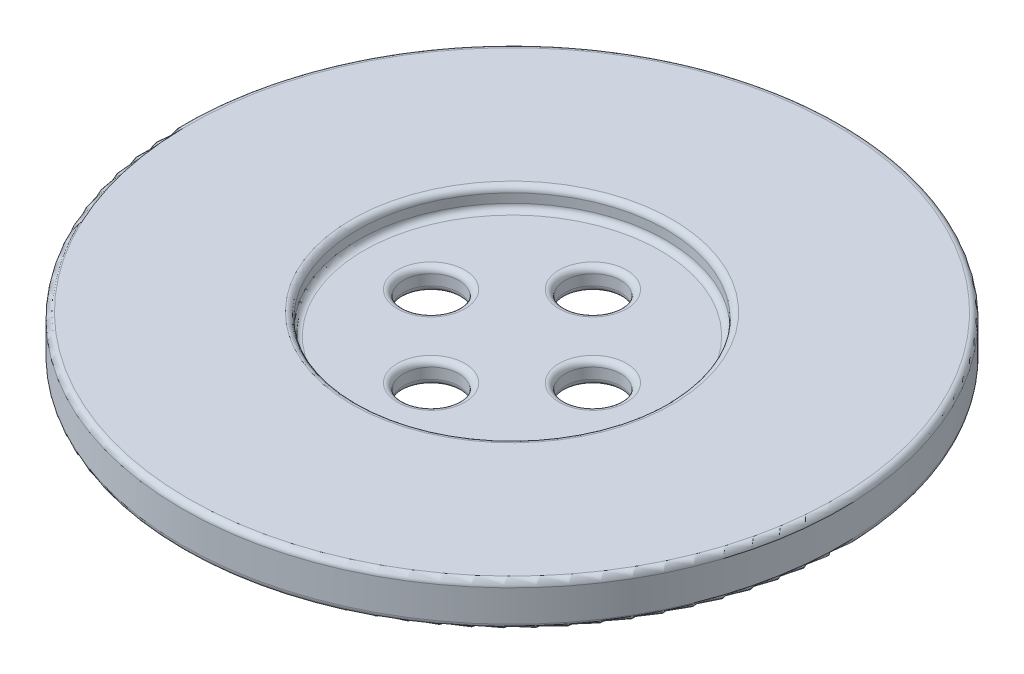
ISO-10303-21;
HEADER;
FILE_DESCRIPTION(('STEP AP214'),'2;1');
FILE_NAME('part.step','',(''),(''),'','','');
FILE_SCHEMA(('AUTOMOTIVE_DESIGN { 1 0 10303 214 1 1 1 1 }'));
ENDSEC;
DATA;
#1=APPLICATION_CONTEXT('core data for automotive mechanical design processes');
#2=APPLICATION_PROTOCOL_DEFINITION('international standard','automotive_design',2000,#1);
#3=PRODUCT_CONTEXT('',#1,'mechanical');
#4=PRODUCT('Part','Part','',(#3));
#5=PRODUCT_RELATED_PRODUCT_CATEGORY('part','',(#4));
#6=PRODUCT_DEFINITION_FORMATION('','',#4);
#7=PRODUCT_DEFINITION_CONTEXT('part definition',#1,'design');
#8=PRODUCT_DEFINITION('design','',#6,#7);
#9=PRODUCT_DEFINITION_SHAPE('','',#8);
#10=(LENGTH_UNIT() NAMED_UNIT(*) SI_UNIT(.MILLI.,.METRE.));
#11=(NAMED_UNIT(*) PLANE_ANGLE_UNIT() SI_UNIT($,.RADIAN.));
#12=(NAMED_UNIT(*) SI_UNIT($,.STERADIAN.) SOLID_ANGLE_UNIT());
#13=UNCERTAINTY_MEASURE_WITH_UNIT(LENGTH_MEASURE(1.E-05),#10,'distance_accuracy_value','');
#14=(GEOMETRIC_REPRESENTATION_CONTEXT(3) GLOBAL_UNCERTAINTY_ASSIGNED_CONTEXT((#13)) GLOBAL_UNIT_ASSIGNED_CONTEXT((#10,
#11,#12)) REPRESENTATION_CONTEXT('',''));
#15=CARTESIAN_POINT('',(0.,0.,0.));
#16=DIRECTION('',(0.,0.,1.));
#17=DIRECTION('',(1.,0.,0.));
#18=AXIS2_PLACEMENT_3D('',#15,#16,#17);
#19=CARTESIAN_POINT('',(0.,2.9,-5.4));
#20=DIRECTION('',(0.,-1.,0.));
#21=DIRECTION('',(0.,0.,-1.));
#22=AXIS2_PLACEMENT_3D('',#19,#20,#21);
#23=CYLINDRICAL_SURFACE('',#22,1.85);
#24=CARTESIAN_POINT('',(0.,1.1,-5.4));
#25=DIRECTION('',(0.,1.,0.));
#26=DIRECTION('',(0.,0.,1.));
#27=AXIS2_PLACEMENT_3D('',#24,#25,#26);
#28=CIRCLE('',#27,1.85);
#29=CARTESIAN_POINT('',(0.,1.1,-3.55));
#30=VERTEX_POINT('',#29);
#31=EDGE_CURVE('E46',#30,#30,#28,.T.);
#32=ORIENTED_EDGE('',*,*,#31,.T.);
#33=EDGE_LOOP('',(#32));
#34=FACE_BOUND('',#33,.T.);
#35=CARTESIAN_POINT('',(0.,0.4,-5.4));
#36=DIRECTION('',(0.,1.,0.));
#37=DIRECTION('',(0.,0.,1.));
#38=AXIS2_PLACEMENT_3D('',#35,#36,#37);
#39=CIRCLE('',#38,1.85);
#40=CARTESIAN_POINT('',(0.,0.4,-3.55));
#41=VERTEX_POINT('',#40);
#42=EDGE_CURVE('E50',#41,#41,#39,.F.);
#43=ORIENTED_EDGE('',*,*,#42,.T.);
#44=EDGE_LOOP('',(#43));
#45=FACE_BOUND('',#44,.T.);
#46=ADVANCED_FACE('F35',(#34,#45),#23,.F.);
#47=CARTESIAN_POINT('',(5.4,2.9,0.));
#48=DIRECTION('',(0.,-1.,0.));
#49=DIRECTION('',(0.,0.,-1.));
#50=AXIS2_PLACEMENT_3D('',#47,#48,#49);
#51=CYLINDRICAL_SURFACE('',#50,1.85);
#52=CARTESIAN_POINT('',(5.4,1.1,0.));
#53=DIRECTION('',(0.,1.,0.));
#54=DIRECTION('',(0.,0.,1.));
#55=AXIS2_PLACEMENT_3D('',#52,#53,#54);
#56=CIRCLE('',#55,1.85);
#57=CARTESIAN_POINT('',(5.4,1.1,1.85));
#58=VERTEX_POINT('',#57);
#59=EDGE_CURVE('E55',#58,#58,#56,.T.);
#60=ORIENTED_EDGE('',*,*,#59,.T.);
#61=EDGE_LOOP('',(#60));
#62=FACE_BOUND('',#61,.T.);
#63=CARTESIAN_POINT('',(5.4,0.4,0.));
#64=DIRECTION('',(0.,1.,0.));
#65=DIRECTION('',(0.,0.,1.));
#66=AXIS2_PLACEMENT_3D('',#63,#64,#65);
#67=CIRCLE('',#66,1.85);
#68=CARTESIAN_POINT('',(5.4,0.4,1.85));
#69=VERTEX_POINT('',#68);
#70=EDGE_CURVE('E58',#69,#69,#67,.F.);
#71=ORIENTED_EDGE('',*,*,#70,.T.);
#72=EDGE_LOOP('',(#71));
#73=FACE_BOUND('',#72,.T.);
#74=ADVANCED_FACE('F177',(#62,#73),#51,.F.);
#75=CARTESIAN_POINT('',(0.,2.9,5.4));
#76=DIRECTION('',(0.,-1.,0.));
#77=DIRECTION('',(0.,0.,-1.));
#78=AXIS2_PLACEMENT_3D('',#75,#76,#77);
#79=CYLINDRICAL_SURFACE('',#78,1.85);
#80=CARTESIAN_POINT('',(0.,1.1,5.4));
#81=DIRECTION('',(0.,1.,0.));
#82=DIRECTION('',(0.,0.,1.));
#83=AXIS2_PLACEMENT_3D('',#80,#81,#82);
#84=CIRCLE('',#83,1.85);
#85=CARTESIAN_POINT('',(0.,1.1,7.25));
#86=VERTEX_POINT('',#85);
#87=EDGE_CURVE('E61',#86,#86,#84,.T.);
#88=ORIENTED_EDGE('',*,*,#87,.T.);
#89=EDGE_LOOP('',(#88));
#90=FACE_BOUND('',#89,.T.);
#91=CARTESIAN_POINT('',(0.,0.4,5.4));
#92=DIRECTION('',(0.,1.,0.));
#93=DIRECTION('',(0.,0.,1.));
#94=AXIS2_PLACEMENT_3D('',#91,#92,#93);
#95=CIRCLE('',#94,1.85);
#96=CARTESIAN_POINT('',(0.,0.4,7.25));
#97=VERTEX_POINT('',#96);
#98=EDGE_CURVE('E64',#97,#97,#95,.F.);
#99=ORIENTED_EDGE('',*,*,#98,.T.);
#100=EDGE_LOOP('',(#99));
#101=FACE_BOUND('',#100,.T.);
#102=ADVANCED_FACE('F183',(#90,#101),#79,.F.);
#103=CARTESIAN_POINT('',(-5.4,2.9,0.));
#104=DIRECTION('',(0.,-1.,0.));
#105=DIRECTION('',(0.,0.,-1.));
#106=AXIS2_PLACEMENT_3D('',#103,#104,#105);
#107=CYLINDRICAL_SURFACE('',#106,1.85);
#108=CARTESIAN_POINT('',(-5.4,1.1,0.));
#109=DIRECTION('',(0.,1.,0.));
#110=DIRECTION('',(0.,0.,1.));
#111=AXIS2_PLACEMENT_3D('',#108,#109,#110);
#112=CIRCLE('',#111,1.85);
#113=CARTESIAN_POINT('',(-5.4,1.1,1.85));
#114=VERTEX_POINT('',#113);
#115=EDGE_CURVE('E10',#114,#114,#112,.T.);
#116=ORIENTED_EDGE('',*,*,#115,.T.);
#117=EDGE_LOOP('',(#116));
#118=FACE_BOUND('',#117,.T.);
#119=CARTESIAN_POINT('',(-5.4,0.4,0.));
#120=DIRECTION('',(0.,1.,0.));
#121=DIRECTION('',(0.,0.,1.));
#122=AXIS2_PLACEMENT_3D('',#119,#120,#121);
#123=CIRCLE('',#122,1.85);
#124=CARTESIAN_POINT('',(-5.4,0.4,1.85));
#125=VERTEX_POINT('',#124);
#126=EDGE_CURVE('E42',#125,#125,#123,.F.);
#127=ORIENTED_EDGE('',*,*,#126,.T.);
#128=EDGE_LOOP('',(#127));
#129=FACE_BOUND('',#128,.T.);
#130=ADVANCED_FACE('F130',(#118,#129),#107,.F.);
#131=CARTESIAN_POINT('',(0.,2.9,0.));
#132=DIRECTION('',(0.,1.,0.));
#133=DIRECTION('',(0.,0.,1.));
#134=AXIS2_PLACEMENT_3D('',#131,#132,#133);
#135=PLANE('',#134);
#136=CARTESIAN_POINT('',(0.,2.9,0.));
#137=DIRECTION('',(0.,1.,0.));
#138=DIRECTION('',(0.,0.,1.));
#139=AXIS2_PLACEMENT_3D('',#136,#137,#138);
#140=CIRCLE('',#139,21.6);
#141=CARTESIAN_POINT('',(0.,2.9,21.6));
#142=VERTEX_POINT('',#141);
#143=EDGE_CURVE('E88',#142,#142,#140,.T.);
#144=ORIENTED_EDGE('',*,*,#143,.T.);
#145=EDGE_LOOP('',(#144));
#146=FACE_BOUND('',#145,.T.);
#147=CARTESIAN_POINT('',(0.,2.9,0.));
#148=DIRECTION('',(0.,1.,0.));
#149=DIRECTION('',(0.,0.,1.));
#150=AXIS2_PLACEMENT_3D('',#147,#148,#149);
#151=CIRCLE('',#150,10.7);
#152=CARTESIAN_POINT('',(0.,2.9,10.7));
#153=VERTEX_POINT('',#152);
#154=EDGE_CURVE('E91',#153,#153,#151,.F.);
#155=ORIENTED_EDGE('',*,*,#154,.T.);
#156=EDGE_LOOP('',(#155));
#157=FACE_BOUND('',#156,.T.);
#158=ADVANCED_FACE('F126',(#146,#157),#135,.T.);
#159=CARTESIAN_POINT('',(0.,0.,0.));
#160=DIRECTION('',(0.,1.,0.));
#161=DIRECTION('',(0.,0.,1.));
#162=AXIS2_PLACEMENT_3D('',#159,#160,#161);
#163=PLANE('',#162);
#164=CARTESIAN_POINT('',(0.,0.,0.));
#165=DIRECTION('',(0.,1.,0.));
#166=DIRECTION('',(0.,0.,1.));
#167=AXIS2_PLACEMENT_3D('',#164,#165,#166);
#168=CIRCLE('',#167,21.6);
#169=CARTESIAN_POINT('',(0.,0.,21.6));
#170=VERTEX_POINT('',#169);
#171=EDGE_CURVE('E94',#170,#170,#168,.F.);
#172=ORIENTED_EDGE('',*,*,#171,.T.);
#173=EDGE_LOOP('',(#172));
#174=FACE_BOUND('',#173,.T.);
#175=CARTESIAN_POINT('',(0.,0.,5.4));
#176=DIRECTION('',(0.,1.,0.));
#177=DIRECTION('',(0.,0.,1.));
#178=AXIS2_PLACEMENT_3D('',#175,#176,#177);
#179=CIRCLE('',#178,2.25);
#180=CARTESIAN_POINT('',(0.,0.,7.65));
#181=VERTEX_POINT('',#180);
#182=EDGE_CURVE('E97',#181,#181,#179,.T.);
#183=ORIENTED_EDGE('',*,*,#182,.T.);
#184=EDGE_LOOP('',(#183));
#185=FACE_BOUND('',#184,.T.);
#186=CARTESIAN_POINT('',(5.4,0.,0.));
#187=DIRECTION('',(0.,1.,0.));
#188=DIRECTION('',(0.,0.,1.));
#189=AXIS2_PLACEMENT_3D('',#186,#187,#188);
#190=CIRCLE('',#189,2.25);
#191=CARTESIAN_POINT('',(5.4,0.,2.25));
#192=VERTEX_POINT('',#191);
#193=EDGE_CURVE('E100',#192,#192,#190,.T.);
#194=ORIENTED_EDGE('',*,*,#193,.T.);
#195=EDGE_LOOP('',(#194));
#196=FACE_BOUND('',#195,.T.);
#197=CARTESIAN_POINT('',(0.,0.,-5.4));
#198=DIRECTION('',(0.,1.,0.));
#199=DIRECTION('',(0.,0.,1.));
#200=AXIS2_PLACEMENT_3D('',#197,#198,#199);
#201=CIRCLE('',#200,2.25);
#202=CARTESIAN_POINT('',(0.,0.,-3.15));
#203=VERTEX_POINT('',#202);
#204=EDGE_CURVE('E103',#203,#203,#201,.T.);
#205=ORIENTED_EDGE('',*,*,#204,.T.);
#206=EDGE_LOOP('',(#205));
#207=FACE_BOUND('',#206,.T.);
#208=CARTESIAN_POINT('',(-5.4,0.,0.));
#209=DIRECTION('',(0.,1.,0.));
#210=DIRECTION('',(0.,0.,1.));
#211=AXIS2_PLACEMENT_3D('',#208,#209,#210);
#212=CIRCLE('',#211,2.25);
#213=CARTESIAN_POINT('',(-5.4,0.,2.25));
#214=VERTEX_POINT('',#213);
#215=EDGE_CURVE('E106',#214,#214,#212,.T.);
#216=ORIENTED_EDGE('',*,*,#215,.T.);
#217=EDGE_LOOP('',(#216));
#218=FACE_BOUND('',#217,.T.);
#219=ADVANCED_FACE('F129',(#174,#185,#196,#207,#218),#163,.F.);
#220=CARTESIAN_POINT('',(0.,2.9,0.));
#221=DIRECTION('',(0.,-1.,0.));
#222=DIRECTION('',(0.,0.,-1.));
#223=AXIS2_PLACEMENT_3D('',#220,#221,#222);
#224=CYLINDRICAL_SURFACE('',#223,22.);
#225=CARTESIAN_POINT('',(0.,0.4,0.));
#226=DIRECTION('',(0.,1.,0.));
#227=DIRECTION('',(0.,0.,1.));
#228=AXIS2_PLACEMENT_3D('',#225,#226,#227);
#229=CIRCLE('',#228,22.);
#230=CARTESIAN_POINT('',(0.,0.4,22.));
#231=VERTEX_POINT('',#230);
#232=EDGE_CURVE('E109',#231,#231,#229,.T.);
#233=ORIENTED_EDGE('',*,*,#232,.T.);
#234=EDGE_LOOP('',(#233));
#235=FACE_BOUND('',#234,.T.);
#236=CARTESIAN_POINT('',(0.,2.5,0.));
#237=DIRECTION('',(0.,1.,0.));
#238=DIRECTION('',(0.,0.,1.));
#239=AXIS2_PLACEMENT_3D('',#236,#237,#238);
#240=CIRCLE('',#239,22.);
#241=CARTESIAN_POINT('',(0.,2.5,22.));
#242=VERTEX_POINT('',#241);
#243=EDGE_CURVE('E112',#242,#242,#240,.F.);
#244=ORIENTED_EDGE('',*,*,#243,.T.);
#245=EDGE_LOOP('',(#244));
#246=FACE_BOUND('',#245,.T.);
#247=ADVANCED_FACE('F116',(#235,#246),#224,.T.);
#248=CARTESIAN_POINT('',(0.,1.5,0.));
#249=DIRECTION('',(0.,1.,0.));
#250=DIRECTION('',(0.,0.,1.));
#251=AXIS2_PLACEMENT_3D('',#248,#249,#250);
#252=CYLINDRICAL_SURFACE('',#251,10.3);
#253=CARTESIAN_POINT('',(0.,2.5,0.));
#254=DIRECTION('',(0.,1.,0.));
#255=DIRECTION('',(0.,0.,1.));
#256=AXIS2_PLACEMENT_3D('',#253,#254,#255);
#257=CIRCLE('',#256,10.3);
#258=CARTESIAN_POINT('',(0.,2.5,10.3));
#259=VERTEX_POINT('',#258);
#260=EDGE_CURVE('E82',#259,#259,#257,.T.);
#261=ORIENTED_EDGE('',*,*,#260,.T.);
#262=EDGE_LOOP('',(#261));
#263=FACE_BOUND('',#262,.T.);
#264=CARTESIAN_POINT('',(0.,1.9,0.));
#265=DIRECTION('',(0.,1.,0.));
#266=DIRECTION('',(0.,0.,1.));
#267=AXIS2_PLACEMENT_3D('',#264,#265,#266);
#268=CIRCLE('',#267,10.3);
#269=CARTESIAN_POINT('',(0.,1.9,10.3));
#270=VERTEX_POINT('',#269);
#271=EDGE_CURVE('E85',#270,#270,#268,.F.);
#272=ORIENTED_EDGE('',*,*,#271,.T.);
#273=EDGE_LOOP('',(#272));
#274=FACE_BOUND('',#273,.T.);
#275=ADVANCED_FACE('F140',(#263,#274),#252,.F.);
#276=CARTESIAN_POINT('',(0.,1.5,0.));
#277=DIRECTION('',(0.,1.,0.));
#278=DIRECTION('',(0.,0.,1.));
#279=AXIS2_PLACEMENT_3D('',#276,#277,#278);
#280=PLANE('',#279);
#281=CARTESIAN_POINT('',(0.,1.5,0.));
#282=DIRECTION('',(0.,1.,0.));
#283=DIRECTION('',(0.,0.,1.));
#284=AXIS2_PLACEMENT_3D('',#281,#282,#283);
#285=CIRCLE('',#284,9.9);
#286=CARTESIAN_POINT('',(0.,1.5,9.9));
#287=VERTEX_POINT('',#286);
#288=EDGE_CURVE('E67',#287,#287,#285,.T.);
#289=ORIENTED_EDGE('',*,*,#288,.T.);
#290=EDGE_LOOP('',(#289));
#291=FACE_BOUND('',#290,.T.);
#292=CARTESIAN_POINT('',(0.,1.5,5.4));
#293=DIRECTION('',(0.,1.,0.));
#294=DIRECTION('',(0.,0.,1.));
#295=AXIS2_PLACEMENT_3D('',#292,#293,#294);
#296=CIRCLE('',#295,2.25);
#297=CARTESIAN_POINT('',(0.,1.5,7.65));
#298=VERTEX_POINT('',#297);
#299=EDGE_CURVE('E70',#298,#298,#296,.F.);
#300=ORIENTED_EDGE('',*,*,#299,.T.);
#301=EDGE_LOOP('',(#300));
#302=FACE_BOUND('',#301,.T.);
#303=CARTESIAN_POINT('',(5.4,1.5,0.));
#304=DIRECTION('',(0.,1.,0.));
#305=DIRECTION('',(0.,0.,1.));
#306=AXIS2_PLACEMENT_3D('',#303,#304,#305);
#307=CIRCLE('',#306,2.25);
#308=CARTESIAN_POINT('',(5.4,1.5,2.25));
#309=VERTEX_POINT('',#308);
#310=EDGE_CURVE('E73',#309,#309,#307,.F.);
#311=ORIENTED_EDGE('',*,*,#310,.T.);
#312=EDGE_LOOP('',(#311));
#313=FACE_BOUND('',#312,.T.);
#314=CARTESIAN_POINT('',(0.,1.5,-5.4));
#315=DIRECTION('',(0.,1.,0.));
#316=DIRECTION('',(0.,0.,1.));
#317=AXIS2_PLACEMENT_3D('',#314,#315,#316);
#318=CIRCLE('',#317,2.25);
#319=CARTESIAN_POINT('',(0.,1.5,-3.15));
#320=VERTEX_POINT('',#319);
#321=EDGE_CURVE('E76',#320,#320,#318,.F.);
#322=ORIENTED_EDGE('',*,*,#321,.T.);
#323=EDGE_LOOP('',(#322));
#324=FACE_BOUND('',#323,.T.);
#325=CARTESIAN_POINT('',(-5.4,1.5,0.));
#326=DIRECTION('',(0.,1.,0.));
#327=DIRECTION('',(0.,0.,1.));
#328=AXIS2_PLACEMENT_3D('',#325,#326,#327);
#329=CIRCLE('',#328,2.25);
#330=CARTESIAN_POINT('',(-5.4,1.5,2.25));
#331=VERTEX_POINT('',#330);
#332=EDGE_CURVE('E79',#331,#331,#329,.F.);
#333=ORIENTED_EDGE('',*,*,#332,.T.);
#334=EDGE_LOOP('',(#333));
#335=FACE_BOUND('',#334,.T.);
#336=ADVANCED_FACE('F143',(#291,#302,#313,#324,#335),#280,.T.);
#337=CARTESIAN_POINT('',(0.,0.4,0.));
#338=DIRECTION('',(0.,1.,0.));
#339=DIRECTION('',(0.,0.,1.));
#340=AXIS2_PLACEMENT_3D('',#337,#338,#339);
#341=TOROIDAL_SURFACE('',#340,21.6,0.4);
#342=ORIENTED_EDGE('',*,*,#171,.F.);
#343=EDGE_LOOP('',(#342));
#344=FACE_BOUND('',#343,.T.);
#345=ORIENTED_EDGE('',*,*,#232,.F.);
#346=EDGE_LOOP('',(#345));
#347=FACE_BOUND('',#346,.T.);
#348=ADVANCED_FACE('F122',(#344,#347),#341,.T.);
#349=CARTESIAN_POINT('',(0.,2.5,0.));
#350=DIRECTION('',(0.,1.,0.));
#351=DIRECTION('',(0.,0.,1.));
#352=AXIS2_PLACEMENT_3D('',#349,#350,#351);
#353=TOROIDAL_SURFACE('',#352,21.6,0.4);
#354=ORIENTED_EDGE('',*,*,#243,.F.);
#355=EDGE_LOOP('',(#354));
#356=FACE_BOUND('',#355,.T.);
#357=ORIENTED_EDGE('',*,*,#143,.F.);
#358=EDGE_LOOP('',(#357));
#359=FACE_BOUND('',#358,.T.);
#360=ADVANCED_FACE('F118',(#356,#359),#353,.T.);
#361=CARTESIAN_POINT('',(0.,2.5,0.));
#362=DIRECTION('',(0.,1.,0.));
#363=DIRECTION('',(0.,0.,1.));
#364=AXIS2_PLACEMENT_3D('',#361,#362,#363);
#365=TOROIDAL_SURFACE('',#364,10.7,0.4);
#366=ORIENTED_EDGE('',*,*,#154,.F.);
#367=EDGE_LOOP('',(#366));
#368=FACE_BOUND('',#367,.T.);
#369=ORIENTED_EDGE('',*,*,#260,.F.);
#370=EDGE_LOOP('',(#369));
#371=FACE_BOUND('',#370,.T.);
#372=ADVANCED_FACE('F121',(#368,#371),#365,.T.);
#373=CARTESIAN_POINT('',(0.,1.9,0.));
#374=DIRECTION('',(0.,1.,0.));
#375=DIRECTION('',(0.,0.,1.));
#376=AXIS2_PLACEMENT_3D('',#373,#374,#375);
#377=TOROIDAL_SURFACE('',#376,9.9,0.4);
#378=ORIENTED_EDGE('',*,*,#271,.F.);
#379=EDGE_LOOP('',(#378));
#380=FACE_BOUND('',#379,.T.);
#381=ORIENTED_EDGE('',*,*,#288,.F.);
#382=EDGE_LOOP('',(#381));
#383=FACE_BOUND('',#382,.T.);
#384=ADVANCED_FACE('F136',(#380,#383),#377,.F.);
#385=CARTESIAN_POINT('',(0.,1.1,5.4));
#386=DIRECTION('',(0.,1.,0.));
#387=DIRECTION('',(0.,0.,1.));
#388=AXIS2_PLACEMENT_3D('',#385,#386,#387);
#389=TOROIDAL_SURFACE('',#388,2.25,0.4);
#390=ORIENTED_EDGE('',*,*,#299,.F.);
#391=EDGE_LOOP('',(#390));
#392=FACE_BOUND('',#391,.T.);
#393=ORIENTED_EDGE('',*,*,#87,.F.);
#394=EDGE_LOOP('',(#393));
#395=FACE_BOUND('',#394,.T.);
#396=ADVANCED_FACE('F149',(#392,#395),#389,.T.);
#397=CARTESIAN_POINT('',(0.,0.4,5.4));
#398=DIRECTION('',(0.,1.,0.));
#399=DIRECTION('',(0.,0.,1.));
#400=AXIS2_PLACEMENT_3D('',#397,#398,#399);
#401=TOROIDAL_SURFACE('',#400,2.25,0.4);
#402=ORIENTED_EDGE('',*,*,#98,.F.);
#403=EDGE_LOOP('',(#402));
#404=FACE_BOUND('',#403,.T.);
#405=ORIENTED_EDGE('',*,*,#182,.F.);
#406=EDGE_LOOP('',(#405));
#407=FACE_BOUND('',#406,.T.);
#408=ADVANCED_FACE('F200',(#404,#407),#401,.T.);
#409=CARTESIAN_POINT('',(5.4,1.1,0.));
#410=DIRECTION('',(0.,1.,0.));
#411=DIRECTION('',(0.,0.,1.));
#412=AXIS2_PLACEMENT_3D('',#409,#410,#411);
#413=TOROIDAL_SURFACE('',#412,2.25,0.4);
#414=ORIENTED_EDGE('',*,*,#310,.F.);
#415=EDGE_LOOP('',(#414));
#416=FACE_BOUND('',#415,.T.);
#417=ORIENTED_EDGE('',*,*,#59,.F.);
#418=EDGE_LOOP('',(#417));
#419=FACE_BOUND('',#418,.T.);
#420=ADVANCED_FACE('F204',(#416,#419),#413,.T.);
#421=CARTESIAN_POINT('',(5.4,0.4,0.));
#422=DIRECTION('',(0.,1.,0.));
#423=DIRECTION('',(0.,0.,1.));
#424=AXIS2_PLACEMENT_3D('',#421,#422,#423);
#425=TOROIDAL_SURFACE('',#424,2.25,0.4);
#426=ORIENTED_EDGE('',*,*,#70,.F.);
#427=EDGE_LOOP('',(#426));
#428=FACE_BOUND('',#427,.T.);
#429=ORIENTED_EDGE('',*,*,#193,.F.);
#430=EDGE_LOOP('',(#429));
#431=FACE_BOUND('',#430,.T.);
#432=ADVANCED_FACE('F208',(#428,#431),#425,.T.);
#433=CARTESIAN_POINT('',(0.,1.1,-5.4));
#434=DIRECTION('',(0.,1.,0.));
#435=DIRECTION('',(0.,0.,1.));
#436=AXIS2_PLACEMENT_3D('',#433,#434,#435);
#437=TOROIDAL_SURFACE('',#436,2.25,0.4);
#438=ORIENTED_EDGE('',*,*,#321,.F.);
#439=EDGE_LOOP('',(#438));
#440=FACE_BOUND('',#439,.T.);
#441=ORIENTED_EDGE('',*,*,#31,.F.);
#442=EDGE_LOOP('',(#441));
#443=FACE_BOUND('',#442,.T.);
#444=ADVANCED_FACE('F173',(#440,#443),#437,.T.);
#445=CARTESIAN_POINT('',(0.,0.4,-5.4));
#446=DIRECTION('',(0.,1.,0.));
#447=DIRECTION('',(0.,0.,1.));
#448=AXIS2_PLACEMENT_3D('',#445,#446,#447);
#449=TOROIDAL_SURFACE('',#448,2.25,0.4);
#450=ORIENTED_EDGE('',*,*,#42,.F.);
#451=EDGE_LOOP('',(#450));
#452=FACE_BOUND('',#451,.T.);
#453=ORIENTED_EDGE('',*,*,#204,.F.);
#454=EDGE_LOOP('',(#453));
#455=FACE_BOUND('',#454,.T.);
#456=ADVANCED_FACE('F167',(#452,#455),#449,.T.);
#457=CARTESIAN_POINT('',(-5.4,1.1,0.));
#458=DIRECTION('',(0.,1.,0.));
#459=DIRECTION('',(0.,0.,1.));
#460=AXIS2_PLACEMENT_3D('',#457,#458,#459);
#461=TOROIDAL_SURFACE('',#460,2.25,0.4);
#462=ORIENTED_EDGE('',*,*,#332,.F.);
#463=EDGE_LOOP('',(#462));
#464=FACE_BOUND('',#463,.T.);
#465=ORIENTED_EDGE('',*,*,#115,.F.);
#466=EDGE_LOOP('',(#465));
#467=FACE_BOUND('',#466,.T.);
#468=ADVANCED_FACE('F164',(#464,#467),#461,.T.);
#469=CARTESIAN_POINT('',(-5.4,0.4,0.));
#470=DIRECTION('',(0.,1.,0.));
#471=DIRECTION('',(0.,0.,1.));
#472=AXIS2_PLACEMENT_3D('',#469,#470,#471);
#473=TOROIDAL_SURFACE('',#472,2.25,0.4);
#474=ORIENTED_EDGE('',*,*,#126,.F.);
#475=EDGE_LOOP('',(#474));
#476=FACE_BOUND('',#475,.T.);
#477=ORIENTED_EDGE('',*,*,#215,.F.);
#478=EDGE_LOOP('',(#477));
#479=FACE_BOUND('',#478,.T.);
#480=ADVANCED_FACE('F37',(#476,#479),#473,.T.);
#481=CLOSED_SHELL('',(#46,#74,#102,#130,#158,#219,#247,#275,#336,#348,#360,#372,#384,#396,#408,
#420,#432,#444,#456,#468,#480));
#482=MANIFOLD_SOLID_BREP('B2',#481);
#483=ADVANCED_BREP_SHAPE_REPRESENTATION('',(#18,#482),#14);
#484=SHAPE_DEFINITION_REPRESENTATION(#9,#483);
ENDSEC;
END-ISO-10303-21;
